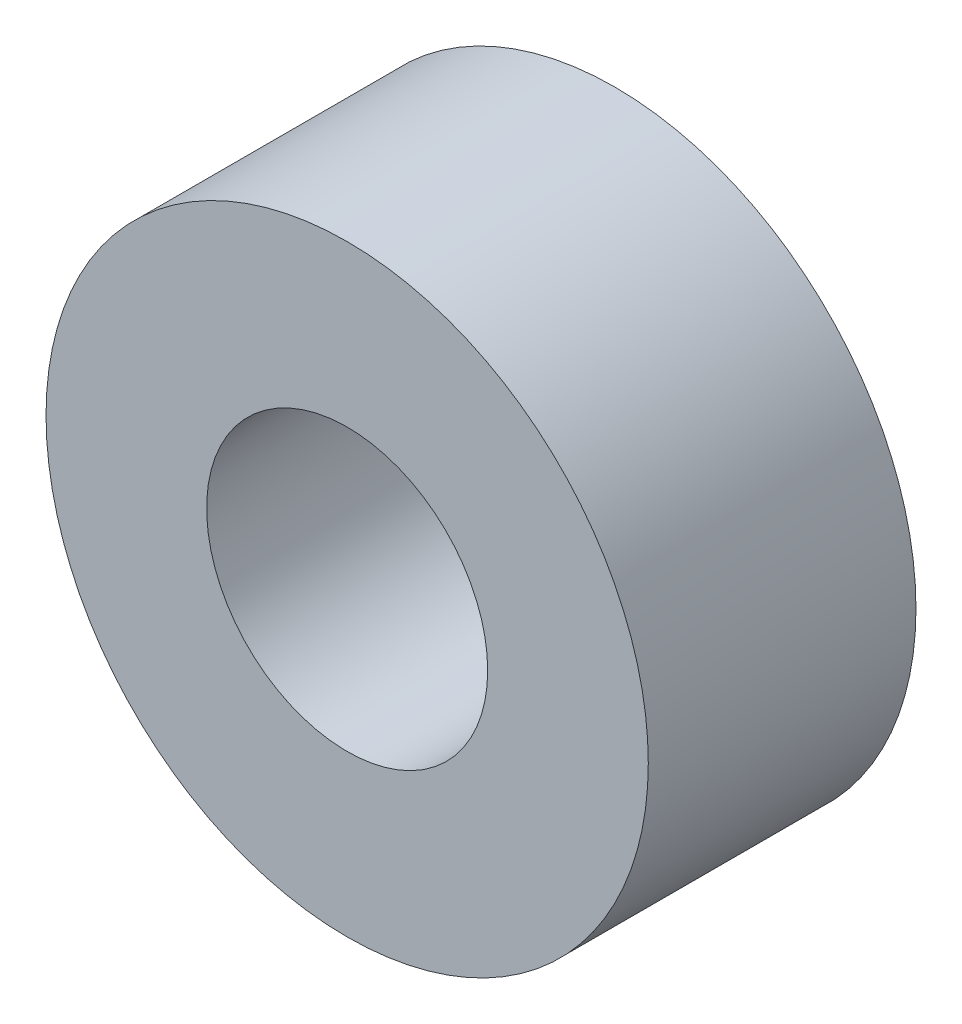
ISO-10303-21;
HEADER;
FILE_DESCRIPTION(('STEP AP214'),'2;1');
FILE_NAME('part.step','',(''),(''),'','','');
FILE_SCHEMA(('AUTOMOTIVE_DESIGN { 1 0 10303 214 1 1 1 1 }'));
ENDSEC;
DATA;
#1=APPLICATION_CONTEXT('core data for automotive mechanical design processes');
#2=APPLICATION_PROTOCOL_DEFINITION('international standard','automotive_design',2000,#1);
#3=PRODUCT_CONTEXT('',#1,'mechanical');
#4=PRODUCT('Part','Part','',(#3));
#5=PRODUCT_RELATED_PRODUCT_CATEGORY('part','',(#4));
#6=PRODUCT_DEFINITION_FORMATION('','',#4);
#7=PRODUCT_DEFINITION_CONTEXT('part definition',#1,'design');
#8=PRODUCT_DEFINITION('design','',#6,#7);
#9=PRODUCT_DEFINITION_SHAPE('','',#8);
#10=(LENGTH_UNIT() NAMED_UNIT(*) SI_UNIT(.MILLI.,.METRE.));
#11=(NAMED_UNIT(*) PLANE_ANGLE_UNIT() SI_UNIT($,.RADIAN.));
#12=(NAMED_UNIT(*) SI_UNIT($,.STERADIAN.) SOLID_ANGLE_UNIT());
#13=UNCERTAINTY_MEASURE_WITH_UNIT(LENGTH_MEASURE(1.E-05),#10,'distance_accuracy_value','');
#14=(GEOMETRIC_REPRESENTATION_CONTEXT(3) GLOBAL_UNCERTAINTY_ASSIGNED_CONTEXT((#13)) GLOBAL_UNIT_ASSIGNED_CONTEXT((#10,
#11,#12)) REPRESENTATION_CONTEXT('',''));
#15=CARTESIAN_POINT('',(0.,0.,0.));
#16=DIRECTION('',(0.,0.,1.));
#17=DIRECTION('',(1.,0.,0.));
#18=AXIS2_PLACEMENT_3D('',#15,#16,#17);
#19=CARTESIAN_POINT('',(0.,0.,4.));
#20=DIRECTION('',(0.,0.,1.));
#21=DIRECTION('',(1.,0.,0.));
#22=AXIS2_PLACEMENT_3D('',#19,#20,#21);
#23=PLANE('',#22);
#24=CARTESIAN_POINT('',(0.,0.,4.));
#25=DIRECTION('',(0.,0.,1.));
#26=DIRECTION('',(1.,0.,0.));
#27=AXIS2_PLACEMENT_3D('',#24,#25,#26);
#28=CIRCLE('',#27,4.5);
#29=CARTESIAN_POINT('',(4.5,0.,4.));
#30=VERTEX_POINT('',#29);
#31=EDGE_CURVE('E10',#30,#30,#28,.T.);
#32=ORIENTED_EDGE('',*,*,#31,.T.);
#33=EDGE_LOOP('',(#32));
#34=FACE_BOUND('',#33,.T.);
#35=CARTESIAN_POINT('',(0.,0.,4.));
#36=DIRECTION('',(0.,0.,1.));
#37=DIRECTION('',(1.,0.,0.));
#38=AXIS2_PLACEMENT_3D('',#35,#36,#37);
#39=CIRCLE('',#38,2.1);
#40=CARTESIAN_POINT('',(2.1,0.,4.));
#41=VERTEX_POINT('',#40);
#42=EDGE_CURVE('E46',#41,#41,#39,.T.);
#43=ORIENTED_EDGE('',*,*,#42,.F.);
#44=EDGE_LOOP('',(#43));
#45=FACE_BOUND('',#44,.T.);
#46=ADVANCED_FACE('F35',(#34,#45),#23,.T.);
#47=CARTESIAN_POINT('',(0.,0.,0.));
#48=DIRECTION('',(0.,0.,1.));
#49=DIRECTION('',(1.,0.,0.));
#50=AXIS2_PLACEMENT_3D('',#47,#48,#49);
#51=PLANE('',#50);
#52=CARTESIAN_POINT('',(0.,0.,0.));
#53=DIRECTION('',(0.,0.,1.));
#54=DIRECTION('',(1.,0.,0.));
#55=AXIS2_PLACEMENT_3D('',#52,#53,#54);
#56=CIRCLE('',#55,4.5);
#57=CARTESIAN_POINT('',(4.5,0.,0.));
#58=VERTEX_POINT('',#57);
#59=EDGE_CURVE('E39',#58,#58,#56,.T.);
#60=ORIENTED_EDGE('',*,*,#59,.F.);
#61=EDGE_LOOP('',(#60));
#62=FACE_BOUND('',#61,.T.);
#63=CARTESIAN_POINT('',(0.,0.,0.));
#64=DIRECTION('',(0.,0.,1.));
#65=DIRECTION('',(1.,0.,0.));
#66=AXIS2_PLACEMENT_3D('',#63,#64,#65);
#67=CIRCLE('',#66,2.1);
#68=CARTESIAN_POINT('',(2.1,0.,0.));
#69=VERTEX_POINT('',#68);
#70=EDGE_CURVE('E48',#69,#69,#67,.T.);
#71=ORIENTED_EDGE('',*,*,#70,.T.);
#72=EDGE_LOOP('',(#71));
#73=FACE_BOUND('',#72,.T.);
#74=ADVANCED_FACE('F58',(#62,#73),#51,.F.);
#75=CARTESIAN_POINT('',(0.,0.,4.));
#76=DIRECTION('',(0.,0.,-1.));
#77=DIRECTION('',(-1.,0.,0.));
#78=AXIS2_PLACEMENT_3D('',#75,#76,#77);
#79=CYLINDRICAL_SURFACE('',#78,4.5);
#80=ORIENTED_EDGE('',*,*,#31,.F.);
#81=EDGE_LOOP('',(#80));
#82=FACE_BOUND('',#81,.T.);
#83=ORIENTED_EDGE('',*,*,#59,.T.);
#84=EDGE_LOOP('',(#83));
#85=FACE_BOUND('',#84,.T.);
#86=ADVANCED_FACE('F37',(#82,#85),#79,.T.);
#87=CARTESIAN_POINT('',(0.,0.,4.));
#88=DIRECTION('',(0.,0.,-1.));
#89=DIRECTION('',(-1.,0.,0.));
#90=AXIS2_PLACEMENT_3D('',#87,#88,#89);
#91=CYLINDRICAL_SURFACE('',#90,2.1);
#92=ORIENTED_EDGE('',*,*,#42,.T.);
#93=EDGE_LOOP('',(#92));
#94=FACE_BOUND('',#93,.T.);
#95=ORIENTED_EDGE('',*,*,#70,.F.);
#96=EDGE_LOOP('',(#95));
#97=FACE_BOUND('',#96,.T.);
#98=ADVANCED_FACE('F54',(#94,#97),#91,.F.);
#99=CLOSED_SHELL('',(#46,#74,#86,#98));
#100=MANIFOLD_SOLID_BREP('B2',#99);
#101=ADVANCED_BREP_SHAPE_REPRESENTATION('',(#18,#100),#14);
#102=SHAPE_DEFINITION_REPRESENTATION(#9,#101);
ENDSEC;
END-ISO-10303-21;
